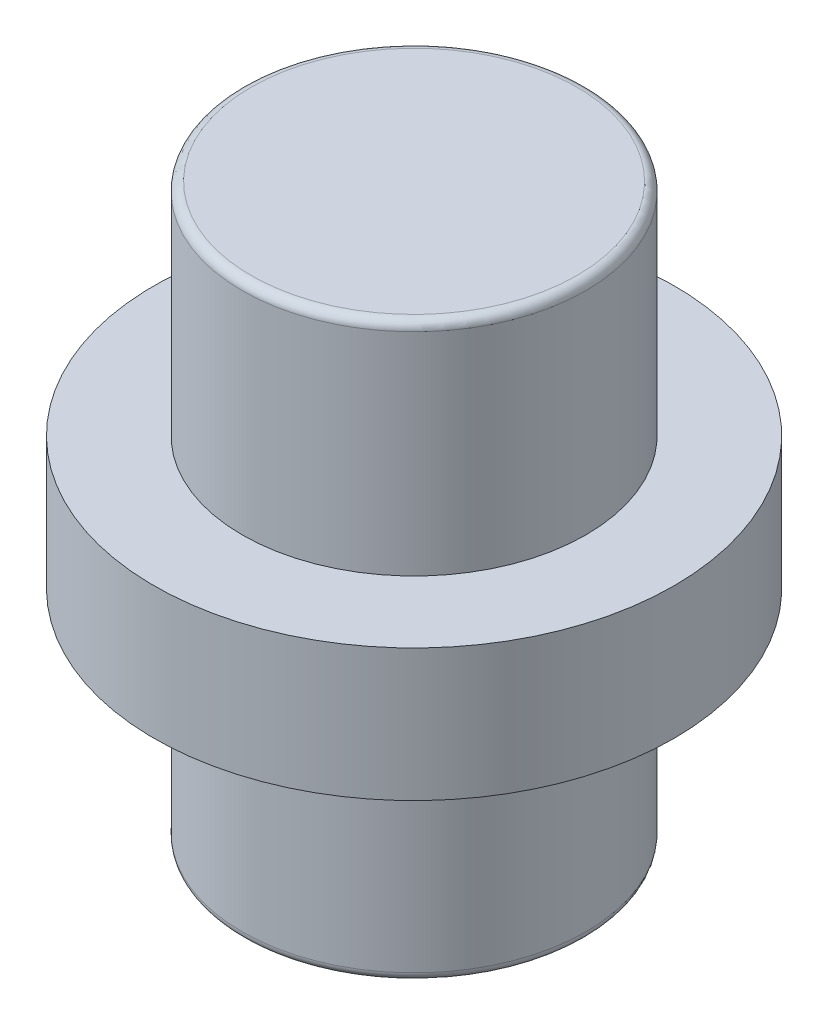
ISO-10303-21;
HEADER;
FILE_DESCRIPTION(('STEP AP214'),'2;1');
FILE_NAME('part.step','',(''),(''),'','','');
FILE_SCHEMA(('AUTOMOTIVE_DESIGN { 1 0 10303 214 1 1 1 1 }'));
ENDSEC;
DATA;
#1=APPLICATION_CONTEXT('core data for automotive mechanical design processes');
#2=APPLICATION_PROTOCOL_DEFINITION('international standard','automotive_design',2000,#1);
#3=PRODUCT_CONTEXT('',#1,'mechanical');
#4=PRODUCT('Part','Part','',(#3));
#5=PRODUCT_RELATED_PRODUCT_CATEGORY('part','',(#4));
#6=PRODUCT_DEFINITION_FORMATION('','',#4);
#7=PRODUCT_DEFINITION_CONTEXT('part definition',#1,'design');
#8=PRODUCT_DEFINITION('design','',#6,#7);
#9=PRODUCT_DEFINITION_SHAPE('','',#8);
#10=(LENGTH_UNIT() NAMED_UNIT(*) SI_UNIT(.MILLI.,.METRE.));
#11=(NAMED_UNIT(*) PLANE_ANGLE_UNIT() SI_UNIT($,.RADIAN.));
#12=(NAMED_UNIT(*) SI_UNIT($,.STERADIAN.) SOLID_ANGLE_UNIT());
#13=UNCERTAINTY_MEASURE_WITH_UNIT(LENGTH_MEASURE(1.E-05),#10,'distance_accuracy_value','');
#14=(GEOMETRIC_REPRESENTATION_CONTEXT(3) GLOBAL_UNCERTAINTY_ASSIGNED_CONTEXT((#13)) GLOBAL_UNIT_ASSIGNED_CONTEXT((#10,
#11,#12)) REPRESENTATION_CONTEXT('',''));
#15=CARTESIAN_POINT('',(0.,0.,0.));
#16=DIRECTION('',(0.,0.,1.));
#17=DIRECTION('',(1.,0.,0.));
#18=AXIS2_PLACEMENT_3D('',#15,#16,#17);
#19=CARTESIAN_POINT('',(0.,0.,0.));
#20=DIRECTION('',(0.,-1.,0.));
#21=DIRECTION('',(1.,0.,0.));
#22=AXIS2_PLACEMENT_3D('',#19,#20,#21);
#23=PLANE('',#22);
#24=CARTESIAN_POINT('',(0.,0.,0.));
#25=DIRECTION('',(0.,-1.,0.));
#26=DIRECTION('',(1.,0.,0.));
#27=AXIS2_PLACEMENT_3D('',#24,#25,#26);
#28=CIRCLE('',#27,3.7);
#29=CARTESIAN_POINT('',(3.7,0.,0.));
#30=VERTEX_POINT('',#29);
#31=EDGE_CURVE('E46',#30,#30,#28,.T.);
#32=ORIENTED_EDGE('',*,*,#31,.T.);
#33=EDGE_LOOP('',(#32));
#34=FACE_BOUND('',#33,.T.);
#35=ADVANCED_FACE('F31',(#34),#23,.T.);
#36=CARTESIAN_POINT('',(0.,0.,0.));
#37=DIRECTION('',(0.,-1.,0.));
#38=DIRECTION('',(1.,0.,0.));
#39=AXIS2_PLACEMENT_3D('',#36,#37,#38);
#40=CYLINDRICAL_SURFACE('',#39,3.9);
#41=CARTESIAN_POINT('',(0.,0.2,0.));
#42=DIRECTION('',(0.,-1.,0.));
#43=DIRECTION('',(1.,0.,0.));
#44=AXIS2_PLACEMENT_3D('',#41,#42,#43);
#45=CIRCLE('',#44,3.9);
#46=CARTESIAN_POINT('',(3.9,0.2,0.));
#47=VERTEX_POINT('',#46);
#48=EDGE_CURVE('E42',#47,#47,#45,.F.);
#49=ORIENTED_EDGE('',*,*,#48,.T.);
#50=EDGE_LOOP('',(#49));
#51=FACE_BOUND('',#50,.T.);
#52=CARTESIAN_POINT('',(0.,5.,0.));
#53=DIRECTION('',(0.,-1.,0.));
#54=DIRECTION('',(1.,0.,0.));
#55=AXIS2_PLACEMENT_3D('',#52,#53,#54);
#56=CIRCLE('',#55,3.9);
#57=CARTESIAN_POINT('',(3.9,5.,0.));
#58=VERTEX_POINT('',#57);
#59=EDGE_CURVE('E51',#58,#58,#56,.T.);
#60=ORIENTED_EDGE('',*,*,#59,.T.);
#61=EDGE_LOOP('',(#60));
#62=FACE_BOUND('',#61,.T.);
#63=ADVANCED_FACE('F81',(#51,#62),#40,.T.);
#64=CARTESIAN_POINT('',(3.9,5.,0.));
#65=DIRECTION('',(0.,-1.,0.));
#66=DIRECTION('',(1.,0.,0.));
#67=AXIS2_PLACEMENT_3D('',#64,#65,#66);
#68=PLANE('',#67);
#69=CARTESIAN_POINT('',(0.,5.,0.));
#70=DIRECTION('',(0.,-1.,0.));
#71=DIRECTION('',(1.,0.,0.));
#72=AXIS2_PLACEMENT_3D('',#69,#70,#71);
#73=CIRCLE('',#72,5.9);
#74=CARTESIAN_POINT('',(5.9,5.,0.));
#75=VERTEX_POINT('',#74);
#76=EDGE_CURVE('E54',#75,#75,#73,.T.);
#77=ORIENTED_EDGE('',*,*,#76,.T.);
#78=EDGE_LOOP('',(#77));
#79=FACE_BOUND('',#78,.T.);
#80=ORIENTED_EDGE('',*,*,#59,.F.);
#81=EDGE_LOOP('',(#80));
#82=FACE_BOUND('',#81,.T.);
#83=ADVANCED_FACE('F87',(#79,#82),#68,.T.);
#84=CARTESIAN_POINT('',(0.,0.,0.));
#85=DIRECTION('',(0.,-1.,0.));
#86=DIRECTION('',(1.,0.,0.));
#87=AXIS2_PLACEMENT_3D('',#84,#85,#86);
#88=CYLINDRICAL_SURFACE('',#87,5.9);
#89=CARTESIAN_POINT('',(0.,8.,0.));
#90=DIRECTION('',(0.,-1.,0.));
#91=DIRECTION('',(1.,0.,0.));
#92=AXIS2_PLACEMENT_3D('',#89,#90,#91);
#93=CIRCLE('',#92,5.9);
#94=CARTESIAN_POINT('',(5.9,8.,0.));
#95=VERTEX_POINT('',#94);
#96=EDGE_CURVE('E57',#95,#95,#93,.T.);
#97=ORIENTED_EDGE('',*,*,#96,.T.);
#98=EDGE_LOOP('',(#97));
#99=FACE_BOUND('',#98,.T.);
#100=ORIENTED_EDGE('',*,*,#76,.F.);
#101=EDGE_LOOP('',(#100));
#102=FACE_BOUND('',#101,.T.);
#103=ADVANCED_FACE('F78',(#99,#102),#88,.T.);
#104=CARTESIAN_POINT('',(5.9,8.,0.));
#105=DIRECTION('',(0.,1.,0.));
#106=DIRECTION('',(-1.,0.,0.));
#107=AXIS2_PLACEMENT_3D('',#104,#105,#106);
#108=PLANE('',#107);
#109=CARTESIAN_POINT('',(0.,8.,0.));
#110=DIRECTION('',(0.,-1.,0.));
#111=DIRECTION('',(1.,0.,0.));
#112=AXIS2_PLACEMENT_3D('',#109,#110,#111);
#113=CIRCLE('',#112,3.9);
#114=CARTESIAN_POINT('',(3.9,8.,0.));
#115=VERTEX_POINT('',#114);
#116=EDGE_CURVE('E60',#115,#115,#113,.T.);
#117=ORIENTED_EDGE('',*,*,#116,.T.);
#118=EDGE_LOOP('',(#117));
#119=FACE_BOUND('',#118,.T.);
#120=ORIENTED_EDGE('',*,*,#96,.F.);
#121=EDGE_LOOP('',(#120));
#122=FACE_BOUND('',#121,.T.);
#123=ADVANCED_FACE('F64',(#119,#122),#108,.T.);
#124=CARTESIAN_POINT('',(0.,0.,0.));
#125=DIRECTION('',(0.,-1.,0.));
#126=DIRECTION('',(1.,0.,0.));
#127=AXIS2_PLACEMENT_3D('',#124,#125,#126);
#128=CYLINDRICAL_SURFACE('',#127,3.9);
#129=CARTESIAN_POINT('',(0.,12.8,0.));
#130=DIRECTION('',(0.,1.,0.));
#131=DIRECTION('',(-1.,0.,0.));
#132=AXIS2_PLACEMENT_3D('',#129,#130,#131);
#133=CIRCLE('',#132,3.9);
#134=CARTESIAN_POINT('',(-3.9,12.8,0.));
#135=VERTEX_POINT('',#134);
#136=EDGE_CURVE('E38',#135,#135,#133,.F.);
#137=ORIENTED_EDGE('',*,*,#136,.T.);
#138=EDGE_LOOP('',(#137));
#139=FACE_BOUND('',#138,.T.);
#140=ORIENTED_EDGE('',*,*,#116,.F.);
#141=EDGE_LOOP('',(#140));
#142=FACE_BOUND('',#141,.T.);
#143=ADVANCED_FACE('F67',(#139,#142),#128,.T.);
#144=CARTESIAN_POINT('',(3.9,13.,0.));
#145=DIRECTION('',(0.,1.,0.));
#146=DIRECTION('',(-1.,0.,0.));
#147=AXIS2_PLACEMENT_3D('',#144,#145,#146);
#148=PLANE('',#147);
#149=CARTESIAN_POINT('',(0.,13.,0.));
#150=DIRECTION('',(0.,1.,0.));
#151=DIRECTION('',(-1.,0.,0.));
#152=AXIS2_PLACEMENT_3D('',#149,#150,#151);
#153=CIRCLE('',#152,3.7);
#154=CARTESIAN_POINT('',(-3.7,13.,0.));
#155=VERTEX_POINT('',#154);
#156=EDGE_CURVE('E10',#155,#155,#153,.T.);
#157=ORIENTED_EDGE('',*,*,#156,.T.);
#158=EDGE_LOOP('',(#157));
#159=FACE_BOUND('',#158,.T.);
#160=ADVANCED_FACE('F69',(#159),#148,.T.);
#161=CARTESIAN_POINT('',(0.,0.2,0.));
#162=DIRECTION('',(0.,-1.,0.));
#163=DIRECTION('',(1.,0.,0.));
#164=AXIS2_PLACEMENT_3D('',#161,#162,#163);
#165=TOROIDAL_SURFACE('',#164,3.7,0.2);
#166=ORIENTED_EDGE('',*,*,#48,.F.);
#167=EDGE_LOOP('',(#166));
#168=FACE_BOUND('',#167,.T.);
#169=ORIENTED_EDGE('',*,*,#31,.F.);
#170=EDGE_LOOP('',(#169));
#171=FACE_BOUND('',#170,.T.);
#172=ADVANCED_FACE('F75',(#168,#171),#165,.T.);
#173=CARTESIAN_POINT('',(0.,12.8,0.));
#174=DIRECTION('',(0.,1.,0.));
#175=DIRECTION('',(-1.,0.,0.));
#176=AXIS2_PLACEMENT_3D('',#173,#174,#175);
#177=TOROIDAL_SURFACE('',#176,3.7,0.2);
#178=ORIENTED_EDGE('',*,*,#156,.F.);
#179=EDGE_LOOP('',(#178));
#180=FACE_BOUND('',#179,.T.);
#181=ORIENTED_EDGE('',*,*,#136,.F.);
#182=EDGE_LOOP('',(#181));
#183=FACE_BOUND('',#182,.T.);
#184=ADVANCED_FACE('F33',(#180,#183),#177,.T.);
#185=CLOSED_SHELL('',(#35,#63,#83,#103,#123,#143,#160,#172,#184));
#186=MANIFOLD_SOLID_BREP('B2',#185);
#187=ADVANCED_BREP_SHAPE_REPRESENTATION('',(#18,#186),#14);
#188=SHAPE_DEFINITION_REPRESENTATION(#9,#187);
ENDSEC;
END-ISO-10303-21;
